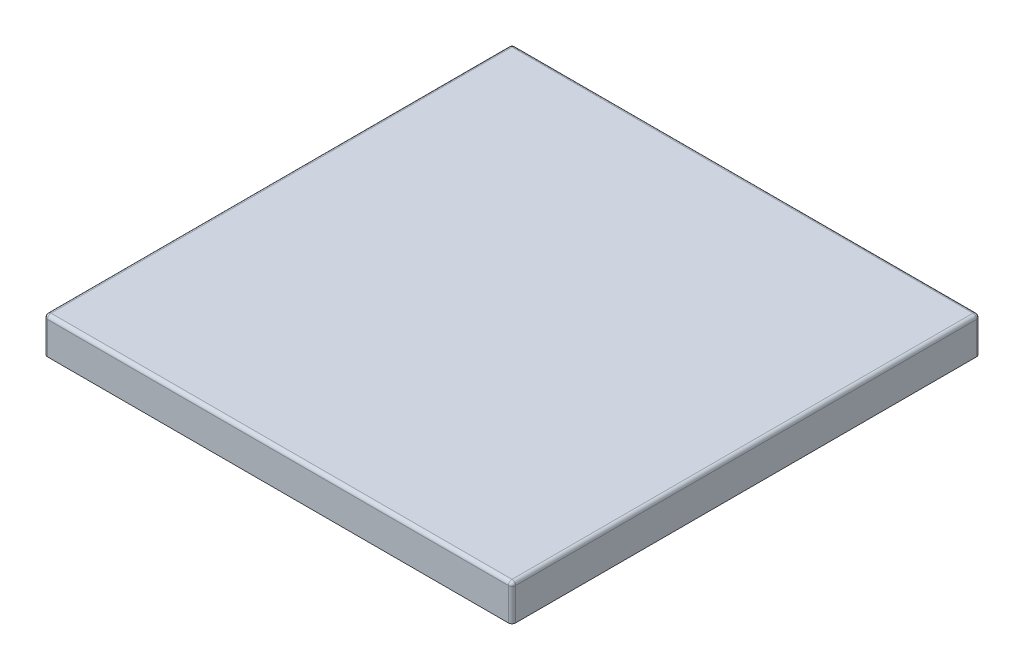
ISO-10303-21;
HEADER;
FILE_DESCRIPTION(('STEP AP214'),'2;1');
FILE_NAME('part.step','',(''),(''),'','','');
FILE_SCHEMA(('AUTOMOTIVE_DESIGN { 1 0 10303 214 1 1 1 1 }'));
ENDSEC;
DATA;
#1=APPLICATION_CONTEXT('core data for automotive mechanical design processes');
#2=APPLICATION_PROTOCOL_DEFINITION('international standard','automotive_design',2000,#1);
#3=PRODUCT_CONTEXT('',#1,'mechanical');
#4=PRODUCT('Part','Part','',(#3));
#5=PRODUCT_RELATED_PRODUCT_CATEGORY('part','',(#4));
#6=PRODUCT_DEFINITION_FORMATION('','',#4);
#7=PRODUCT_DEFINITION_CONTEXT('part definition',#1,'design');
#8=PRODUCT_DEFINITION('design','',#6,#7);
#9=PRODUCT_DEFINITION_SHAPE('','',#8);
#10=(LENGTH_UNIT() NAMED_UNIT(*) SI_UNIT(.MILLI.,.METRE.));
#11=(NAMED_UNIT(*) PLANE_ANGLE_UNIT() SI_UNIT($,.RADIAN.));
#12=(NAMED_UNIT(*) SI_UNIT($,.STERADIAN.) SOLID_ANGLE_UNIT());
#13=UNCERTAINTY_MEASURE_WITH_UNIT(LENGTH_MEASURE(1.E-05),#10,'distance_accuracy_value','');
#14=(GEOMETRIC_REPRESENTATION_CONTEXT(3) GLOBAL_UNCERTAINTY_ASSIGNED_CONTEXT((#13)) GLOBAL_UNIT_ASSIGNED_CONTEXT((#10,
#11,#12)) REPRESENTATION_CONTEXT('',''));
#15=CARTESIAN_POINT('',(0.,0.,0.));
#16=DIRECTION('',(0.,0.,1.));
#17=DIRECTION('',(1.,0.,0.));
#18=AXIS2_PLACEMENT_3D('',#15,#16,#17);
#19=CARTESIAN_POINT('',(65.,10.,65.));
#20=DIRECTION('',(-1.,0.,0.));
#21=DIRECTION('',(0.,0.,1.));
#22=AXIS2_PLACEMENT_3D('',#19,#20,#21);
#23=PLANE('',#22);
#24=DIRECTION('',(0.,-1.,0.));
#25=VECTOR('',#24,1.);
#26=CARTESIAN_POINT('',(65.,10.,-64.));
#27=LINE('',#26,#25);
#28=CARTESIAN_POINT('',(65.,0.,-64.));
#29=VERTEX_POINT('',#28);
#30=CARTESIAN_POINT('',(65.,9.,-64.));
#31=VERTEX_POINT('',#30);
#32=EDGE_CURVE('E164',#29,#31,#27,.F.);
#33=ORIENTED_EDGE('',*,*,#32,.T.);
#34=DIRECTION('',(0.,0.,-1.));
#35=VECTOR('',#34,1.);
#36=CARTESIAN_POINT('',(65.,9.,65.));
#37=LINE('',#36,#35);
#38=CARTESIAN_POINT('',(65.,9.,64.));
#39=VERTEX_POINT('',#38);
#40=EDGE_CURVE('E201',#31,#39,#37,.F.);
#41=ORIENTED_EDGE('',*,*,#40,.T.);
#42=DIRECTION('',(0.,-1.,0.));
#43=VECTOR('',#42,1.);
#44=CARTESIAN_POINT('',(65.,10.,64.));
#45=LINE('',#44,#43);
#46=CARTESIAN_POINT('',(65.,0.,64.));
#47=VERTEX_POINT('',#46);
#48=EDGE_CURVE('E168',#39,#47,#45,.T.);
#49=ORIENTED_EDGE('',*,*,#48,.T.);
#50=DIRECTION('',(0.,0.,-1.));
#51=VECTOR('',#50,1.);
#52=CARTESIAN_POINT('',(65.,0.,65.));
#53=LINE('',#52,#51);
#54=EDGE_CURVE('E241',#47,#29,#53,.T.);
#55=ORIENTED_EDGE('',*,*,#54,.T.);
#56=EDGE_LOOP('',(#33,#41,#49,#55));
#57=FACE_BOUND('',#56,.T.);
#58=ADVANCED_FACE('F41',(#57),#23,.F.);
#59=CARTESIAN_POINT('',(-65.,10.,-65.));
#60=DIRECTION('',(0.,0.,1.));
#61=DIRECTION('',(1.,0.,0.));
#62=AXIS2_PLACEMENT_3D('',#59,#60,#61);
#63=PLANE('',#62);
#64=DIRECTION('',(0.,-1.,0.));
#65=VECTOR('',#64,1.);
#66=CARTESIAN_POINT('',(-64.,10.,-65.));
#67=LINE('',#66,#65);
#68=CARTESIAN_POINT('',(-64.,0.,-65.));
#69=VERTEX_POINT('',#68);
#70=CARTESIAN_POINT('',(-64.,9.,-65.));
#71=VERTEX_POINT('',#70);
#72=EDGE_CURVE('E171',#69,#71,#67,.F.);
#73=ORIENTED_EDGE('',*,*,#72,.T.);
#74=DIRECTION('',(-1.,0.,0.));
#75=VECTOR('',#74,1.);
#76=CARTESIAN_POINT('',(-65.,9.,-65.));
#77=LINE('',#76,#75);
#78=CARTESIAN_POINT('',(64.,9.,-65.));
#79=VERTEX_POINT('',#78);
#80=EDGE_CURVE('E195',#71,#79,#77,.F.);
#81=ORIENTED_EDGE('',*,*,#80,.T.);
#82=DIRECTION('',(0.,-1.,0.));
#83=VECTOR('',#82,1.);
#84=CARTESIAN_POINT('',(64.,10.,-65.));
#85=LINE('',#84,#83);
#86=CARTESIAN_POINT('',(64.,0.,-65.));
#87=VERTEX_POINT('',#86);
#88=EDGE_CURVE('E175',#79,#87,#85,.T.);
#89=ORIENTED_EDGE('',*,*,#88,.T.);
#90=DIRECTION('',(-1.,0.,0.));
#91=VECTOR('',#90,1.);
#92=CARTESIAN_POINT('',(-65.,0.,-65.));
#93=LINE('',#92,#91);
#94=EDGE_CURVE('E149',#87,#69,#93,.T.);
#95=ORIENTED_EDGE('',*,*,#94,.T.);
#96=EDGE_LOOP('',(#73,#81,#89,#95));
#97=FACE_BOUND('',#96,.T.);
#98=ADVANCED_FACE('F255',(#97),#63,.F.);
#99=CARTESIAN_POINT('',(-65.,10.,65.));
#100=DIRECTION('',(1.,0.,0.));
#101=DIRECTION('',(0.,0.,-1.));
#102=AXIS2_PLACEMENT_3D('',#99,#100,#101);
#103=PLANE('',#102);
#104=DIRECTION('',(0.,-1.,0.));
#105=VECTOR('',#104,1.);
#106=CARTESIAN_POINT('',(-65.,10.,64.));
#107=LINE('',#106,#105);
#108=CARTESIAN_POINT('',(-65.,0.,64.));
#109=VERTEX_POINT('',#108);
#110=CARTESIAN_POINT('',(-65.,9.,64.));
#111=VERTEX_POINT('',#110);
#112=EDGE_CURVE('E132',#109,#111,#107,.F.);
#113=ORIENTED_EDGE('',*,*,#112,.T.);
#114=DIRECTION('',(0.,0.,1.));
#115=VECTOR('',#114,1.);
#116=CARTESIAN_POINT('',(-65.,9.,65.));
#117=LINE('',#116,#115);
#118=CARTESIAN_POINT('',(-65.,9.,-64.));
#119=VERTEX_POINT('',#118);
#120=EDGE_CURVE('E11',#111,#119,#117,.F.);
#121=ORIENTED_EDGE('',*,*,#120,.T.);
#122=DIRECTION('',(0.,-1.,0.));
#123=VECTOR('',#122,1.);
#124=CARTESIAN_POINT('',(-65.,10.,-64.));
#125=LINE('',#124,#123);
#126=CARTESIAN_POINT('',(-65.,0.,-64.));
#127=VERTEX_POINT('',#126);
#128=EDGE_CURVE('E137',#119,#127,#125,.T.);
#129=ORIENTED_EDGE('',*,*,#128,.T.);
#130=DIRECTION('',(0.,0.,1.));
#131=VECTOR('',#130,1.);
#132=CARTESIAN_POINT('',(-65.,0.,65.));
#133=LINE('',#132,#131);
#134=EDGE_CURVE('E144',#127,#109,#133,.T.);
#135=ORIENTED_EDGE('',*,*,#134,.T.);
#136=EDGE_LOOP('',(#113,#121,#129,#135));
#137=FACE_BOUND('',#136,.T.);
#138=ADVANCED_FACE('F307',(#137),#103,.F.);
#139=CARTESIAN_POINT('',(-65.,10.,65.));
#140=DIRECTION('',(0.,0.,-1.));
#141=DIRECTION('',(-1.,0.,0.));
#142=AXIS2_PLACEMENT_3D('',#139,#140,#141);
#143=PLANE('',#142);
#144=DIRECTION('',(0.,-1.,0.));
#145=VECTOR('',#144,1.);
#146=CARTESIAN_POINT('',(64.,10.,65.));
#147=LINE('',#146,#145);
#148=CARTESIAN_POINT('',(64.,0.,65.));
#149=VERTEX_POINT('',#148);
#150=CARTESIAN_POINT('',(64.,9.,65.));
#151=VERTEX_POINT('',#150);
#152=EDGE_CURVE('E128',#149,#151,#147,.F.);
#153=ORIENTED_EDGE('',*,*,#152,.T.);
#154=DIRECTION('',(1.,0.,0.));
#155=VECTOR('',#154,1.);
#156=CARTESIAN_POINT('',(-65.,9.,65.));
#157=LINE('',#156,#155);
#158=CARTESIAN_POINT('',(-64.,9.,65.));
#159=VERTEX_POINT('',#158);
#160=EDGE_CURVE('E66',#151,#159,#157,.F.);
#161=ORIENTED_EDGE('',*,*,#160,.T.);
#162=DIRECTION('',(0.,-1.,0.));
#163=VECTOR('',#162,1.);
#164=CARTESIAN_POINT('',(-64.,10.,65.));
#165=LINE('',#164,#163);
#166=CARTESIAN_POINT('',(-64.,0.,65.));
#167=VERTEX_POINT('',#166);
#168=EDGE_CURVE('E119',#159,#167,#165,.T.);
#169=ORIENTED_EDGE('',*,*,#168,.T.);
#170=DIRECTION('',(1.,0.,0.));
#171=VECTOR('',#170,1.);
#172=CARTESIAN_POINT('',(-65.,0.,65.));
#173=LINE('',#172,#171);
#174=EDGE_CURVE('E123',#167,#149,#173,.T.);
#175=ORIENTED_EDGE('',*,*,#174,.T.);
#176=EDGE_LOOP('',(#153,#161,#169,#175));
#177=FACE_BOUND('',#176,.T.);
#178=ADVANCED_FACE('F121',(#177),#143,.F.);
#179=CARTESIAN_POINT('',(0.,10.,0.));
#180=DIRECTION('',(0.,-1.,0.));
#181=DIRECTION('',(0.,0.,-1.));
#182=AXIS2_PLACEMENT_3D('',#179,#180,#181);
#183=PLANE('',#182);
#184=DIRECTION('',(0.,0.,-1.));
#185=VECTOR('',#184,1.);
#186=CARTESIAN_POINT('',(64.,10.,0.));
#187=LINE('',#186,#185);
#188=CARTESIAN_POINT('',(64.,10.,64.));
#189=VERTEX_POINT('',#188);
#190=CARTESIAN_POINT('',(64.,10.,-64.));
#191=VERTEX_POINT('',#190);
#192=EDGE_CURVE('E188',#189,#191,#187,.T.);
#193=ORIENTED_EDGE('',*,*,#192,.T.);
#194=DIRECTION('',(-1.,0.,0.));
#195=VECTOR('',#194,1.);
#196=CARTESIAN_POINT('',(0.,10.,-64.));
#197=LINE('',#196,#195);
#198=CARTESIAN_POINT('',(-64.,10.,-64.));
#199=VERTEX_POINT('',#198);
#200=EDGE_CURVE('E191',#191,#199,#197,.T.);
#201=ORIENTED_EDGE('',*,*,#200,.T.);
#202=DIRECTION('',(0.,0.,1.));
#203=VECTOR('',#202,1.);
#204=CARTESIAN_POINT('',(-64.,10.,0.));
#205=LINE('',#204,#203);
#206=CARTESIAN_POINT('',(-64.,10.,64.));
#207=VERTEX_POINT('',#206);
#208=EDGE_CURVE('E182',#199,#207,#205,.T.);
#209=ORIENTED_EDGE('',*,*,#208,.T.);
#210=DIRECTION('',(1.,0.,0.));
#211=VECTOR('',#210,1.);
#212=CARTESIAN_POINT('',(0.,10.,64.));
#213=LINE('',#212,#211);
#214=EDGE_CURVE('E185',#207,#189,#213,.T.);
#215=ORIENTED_EDGE('',*,*,#214,.T.);
#216=EDGE_LOOP('',(#193,#201,#209,#215));
#217=FACE_BOUND('',#216,.T.);
#218=ADVANCED_FACE('F275',(#217),#183,.F.);
#219=CARTESIAN_POINT('',(0.,0.,0.));
#220=DIRECTION('',(0.,-1.,0.));
#221=DIRECTION('',(0.,0.,-1.));
#222=AXIS2_PLACEMENT_3D('',#219,#220,#221);
#223=PLANE('',#222);
#224=ORIENTED_EDGE('',*,*,#174,.F.);
#225=CARTESIAN_POINT('',(-64.,0.,64.));
#226=DIRECTION('',(0.,-1.,0.));
#227=DIRECTION('',(0.,0.,-1.));
#228=AXIS2_PLACEMENT_3D('',#225,#226,#227);
#229=CIRCLE('',#228,1.);
#230=EDGE_CURVE('E130',#167,#109,#229,.T.);
#231=ORIENTED_EDGE('',*,*,#230,.T.);
#232=ORIENTED_EDGE('',*,*,#134,.F.);
#233=CARTESIAN_POINT('',(-64.,0.,-64.));
#234=DIRECTION('',(0.,-1.,0.));
#235=DIRECTION('',(0.,0.,-1.));
#236=AXIS2_PLACEMENT_3D('',#233,#234,#235);
#237=CIRCLE('',#236,1.);
#238=EDGE_CURVE('E127',#127,#69,#237,.T.);
#239=ORIENTED_EDGE('',*,*,#238,.T.);
#240=ORIENTED_EDGE('',*,*,#94,.F.);
#241=CARTESIAN_POINT('',(64.,0.,-64.));
#242=DIRECTION('',(0.,-1.,0.));
#243=DIRECTION('',(0.,0.,-1.));
#244=AXIS2_PLACEMENT_3D('',#241,#242,#243);
#245=CIRCLE('',#244,1.);
#246=EDGE_CURVE('E155',#87,#29,#245,.T.);
#247=ORIENTED_EDGE('',*,*,#246,.T.);
#248=ORIENTED_EDGE('',*,*,#54,.F.);
#249=CARTESIAN_POINT('',(64.,0.,64.));
#250=DIRECTION('',(0.,-1.,0.));
#251=DIRECTION('',(0.,0.,-1.));
#252=AXIS2_PLACEMENT_3D('',#249,#250,#251);
#253=CIRCLE('',#252,1.);
#254=EDGE_CURVE('E138',#47,#149,#253,.T.);
#255=ORIENTED_EDGE('',*,*,#254,.T.);
#256=EDGE_LOOP('',(#224,#231,#232,#239,#240,#247,#248,#255));
#257=FACE_BOUND('',#256,.T.);
#258=ADVANCED_FACE('F140',(#257),#223,.T.);
#259=CARTESIAN_POINT('',(-64.,10.,64.));
#260=DIRECTION('',(0.,-1.,0.));
#261=DIRECTION('',(0.,0.,-1.));
#262=AXIS2_PLACEMENT_3D('',#259,#260,#261);
#263=CYLINDRICAL_SURFACE('',#262,1.);
#264=ORIENTED_EDGE('',*,*,#168,.F.);
#265=CARTESIAN_POINT('',(-64.,9.,64.));
#266=DIRECTION('',(0.,-1.,0.));
#267=DIRECTION('',(0.,0.,-1.));
#268=AXIS2_PLACEMENT_3D('',#265,#266,#267);
#269=CIRCLE('',#268,1.);
#270=EDGE_CURVE('E51',#159,#111,#269,.T.);
#271=ORIENTED_EDGE('',*,*,#270,.T.);
#272=ORIENTED_EDGE('',*,*,#112,.F.);
#273=ORIENTED_EDGE('',*,*,#230,.F.);
#274=EDGE_LOOP('',(#264,#271,#272,#273));
#275=FACE_BOUND('',#274,.T.);
#276=ADVANCED_FACE('F131',(#275),#263,.T.);
#277=CARTESIAN_POINT('',(64.,10.,64.));
#278=DIRECTION('',(0.,-1.,0.));
#279=DIRECTION('',(0.,0.,-1.));
#280=AXIS2_PLACEMENT_3D('',#277,#278,#279);
#281=CYLINDRICAL_SURFACE('',#280,1.);
#282=ORIENTED_EDGE('',*,*,#48,.F.);
#283=CARTESIAN_POINT('',(64.,9.,64.));
#284=DIRECTION('',(0.,-1.,0.));
#285=DIRECTION('',(0.,0.,-1.));
#286=AXIS2_PLACEMENT_3D('',#283,#284,#285);
#287=CIRCLE('',#286,1.);
#288=EDGE_CURVE('E204',#39,#151,#287,.T.);
#289=ORIENTED_EDGE('',*,*,#288,.T.);
#290=ORIENTED_EDGE('',*,*,#152,.F.);
#291=ORIENTED_EDGE('',*,*,#254,.F.);
#292=EDGE_LOOP('',(#282,#289,#290,#291));
#293=FACE_BOUND('',#292,.T.);
#294=ADVANCED_FACE('F289',(#293),#281,.T.);
#295=CARTESIAN_POINT('',(64.,10.,-64.));
#296=DIRECTION('',(0.,-1.,0.));
#297=DIRECTION('',(0.,0.,-1.));
#298=AXIS2_PLACEMENT_3D('',#295,#296,#297);
#299=CYLINDRICAL_SURFACE('',#298,1.);
#300=ORIENTED_EDGE('',*,*,#88,.F.);
#301=CARTESIAN_POINT('',(64.,9.,-64.));
#302=DIRECTION('',(0.,-1.,0.));
#303=DIRECTION('',(0.,0.,-1.));
#304=AXIS2_PLACEMENT_3D('',#301,#302,#303);
#305=CIRCLE('',#304,1.);
#306=EDGE_CURVE('E198',#79,#31,#305,.T.);
#307=ORIENTED_EDGE('',*,*,#306,.T.);
#308=ORIENTED_EDGE('',*,*,#32,.F.);
#309=ORIENTED_EDGE('',*,*,#246,.F.);
#310=EDGE_LOOP('',(#300,#307,#308,#309));
#311=FACE_BOUND('',#310,.T.);
#312=ADVANCED_FACE('F282',(#311),#299,.T.);
#313=CARTESIAN_POINT('',(-64.,10.,-64.));
#314=DIRECTION('',(0.,-1.,0.));
#315=DIRECTION('',(0.,0.,-1.));
#316=AXIS2_PLACEMENT_3D('',#313,#314,#315);
#317=CYLINDRICAL_SURFACE('',#316,1.);
#318=ORIENTED_EDGE('',*,*,#128,.F.);
#319=CARTESIAN_POINT('',(-64.,9.,-64.));
#320=DIRECTION('',(0.,-1.,0.));
#321=DIRECTION('',(0.,0.,-1.));
#322=AXIS2_PLACEMENT_3D('',#319,#320,#321);
#323=CIRCLE('',#322,1.);
#324=EDGE_CURVE('E178',#119,#71,#323,.T.);
#325=ORIENTED_EDGE('',*,*,#324,.T.);
#326=ORIENTED_EDGE('',*,*,#72,.F.);
#327=ORIENTED_EDGE('',*,*,#238,.F.);
#328=EDGE_LOOP('',(#318,#325,#326,#327));
#329=FACE_BOUND('',#328,.T.);
#330=ADVANCED_FACE('F261',(#329),#317,.T.);
#331=CARTESIAN_POINT('',(64.,9.,64.));
#332=DIRECTION('',(0.,-1.,0.));
#333=DIRECTION('',(0.,0.,-1.));
#334=AXIS2_PLACEMENT_3D('',#331,#332,#333);
#335=SPHERICAL_SURFACE('',#334,1.);
#336=CARTESIAN_POINT('',(64.,9.,64.));
#337=DIRECTION('',(-1.,0.,0.));
#338=DIRECTION('',(0.,0.,1.));
#339=AXIS2_PLACEMENT_3D('',#336,#337,#338);
#340=CIRCLE('',#339,1.);
#341=EDGE_CURVE('E232',#151,#189,#340,.T.);
#342=ORIENTED_EDGE('',*,*,#341,.F.);
#343=ORIENTED_EDGE('',*,*,#288,.F.);
#344=CARTESIAN_POINT('',(64.,9.,64.));
#345=DIRECTION('',(0.,0.,-1.));
#346=DIRECTION('',(-1.,0.,0.));
#347=AXIS2_PLACEMENT_3D('',#344,#345,#346);
#348=CIRCLE('',#347,1.);
#349=EDGE_CURVE('E45',#189,#39,#348,.T.);
#350=ORIENTED_EDGE('',*,*,#349,.F.);
#351=EDGE_LOOP('',(#342,#343,#350));
#352=FACE_BOUND('',#351,.T.);
#353=ADVANCED_FACE('F43',(#352),#335,.T.);
#354=CARTESIAN_POINT('',(64.,9.,0.));
#355=DIRECTION('',(0.,0.,-1.));
#356=DIRECTION('',(-1.,0.,0.));
#357=AXIS2_PLACEMENT_3D('',#354,#355,#356);
#358=CYLINDRICAL_SURFACE('',#357,1.);
#359=ORIENTED_EDGE('',*,*,#349,.T.);
#360=ORIENTED_EDGE('',*,*,#40,.F.);
#361=CARTESIAN_POINT('',(64.,9.,-64.));
#362=DIRECTION('',(0.,0.,-1.));
#363=DIRECTION('',(-1.,0.,0.));
#364=AXIS2_PLACEMENT_3D('',#361,#362,#363);
#365=CIRCLE('',#364,1.);
#366=EDGE_CURVE('E229',#191,#31,#365,.T.);
#367=ORIENTED_EDGE('',*,*,#366,.F.);
#368=ORIENTED_EDGE('',*,*,#192,.F.);
#369=EDGE_LOOP('',(#359,#360,#367,#368));
#370=FACE_BOUND('',#369,.T.);
#371=ADVANCED_FACE('F285',(#370),#358,.T.);
#372=CARTESIAN_POINT('',(0.,9.,64.));
#373=DIRECTION('',(1.,0.,0.));
#374=DIRECTION('',(0.,0.,-1.));
#375=AXIS2_PLACEMENT_3D('',#372,#373,#374);
#376=CYLINDRICAL_SURFACE('',#375,1.);
#377=ORIENTED_EDGE('',*,*,#341,.T.);
#378=ORIENTED_EDGE('',*,*,#214,.F.);
#379=CARTESIAN_POINT('',(-64.,9.,64.));
#380=DIRECTION('',(-1.,0.,0.));
#381=DIRECTION('',(0.,0.,1.));
#382=AXIS2_PLACEMENT_3D('',#379,#380,#381);
#383=CIRCLE('',#382,1.);
#384=EDGE_CURVE('E225',#159,#207,#383,.T.);
#385=ORIENTED_EDGE('',*,*,#384,.F.);
#386=ORIENTED_EDGE('',*,*,#160,.F.);
#387=EDGE_LOOP('',(#377,#378,#385,#386));
#388=FACE_BOUND('',#387,.T.);
#389=ADVANCED_FACE('F291',(#388),#376,.T.);
#390=CARTESIAN_POINT('',(64.,9.,-64.));
#391=DIRECTION('',(0.,-1.,0.));
#392=DIRECTION('',(0.,0.,-1.));
#393=AXIS2_PLACEMENT_3D('',#390,#391,#392);
#394=SPHERICAL_SURFACE('',#393,1.);
#395=ORIENTED_EDGE('',*,*,#366,.T.);
#396=ORIENTED_EDGE('',*,*,#306,.F.);
#397=CARTESIAN_POINT('',(64.,9.,-64.));
#398=DIRECTION('',(-1.,0.,0.));
#399=DIRECTION('',(0.,0.,1.));
#400=AXIS2_PLACEMENT_3D('',#397,#398,#399);
#401=CIRCLE('',#400,1.);
#402=EDGE_CURVE('E221',#191,#79,#401,.T.);
#403=ORIENTED_EDGE('',*,*,#402,.F.);
#404=EDGE_LOOP('',(#395,#396,#403));
#405=FACE_BOUND('',#404,.T.);
#406=ADVANCED_FACE('F284',(#405),#394,.T.);
#407=CARTESIAN_POINT('',(-64.,9.,64.));
#408=DIRECTION('',(0.,-1.,0.));
#409=DIRECTION('',(0.,0.,-1.));
#410=AXIS2_PLACEMENT_3D('',#407,#408,#409);
#411=SPHERICAL_SURFACE('',#410,1.);
#412=ORIENTED_EDGE('',*,*,#270,.F.);
#413=ORIENTED_EDGE('',*,*,#384,.T.);
#414=CARTESIAN_POINT('',(-64.,9.,64.));
#415=DIRECTION('',(0.,0.,-1.));
#416=DIRECTION('',(-1.,0.,0.));
#417=AXIS2_PLACEMENT_3D('',#414,#415,#416);
#418=CIRCLE('',#417,1.);
#419=EDGE_CURVE('E217',#111,#207,#418,.T.);
#420=ORIENTED_EDGE('',*,*,#419,.F.);
#421=EDGE_LOOP('',(#412,#413,#420));
#422=FACE_BOUND('',#421,.T.);
#423=ADVANCED_FACE('F293',(#422),#411,.T.);
#424=CARTESIAN_POINT('',(0.,9.,-64.));
#425=DIRECTION('',(-1.,0.,0.));
#426=DIRECTION('',(0.,0.,1.));
#427=AXIS2_PLACEMENT_3D('',#424,#425,#426);
#428=CYLINDRICAL_SURFACE('',#427,1.);
#429=ORIENTED_EDGE('',*,*,#402,.T.);
#430=ORIENTED_EDGE('',*,*,#80,.F.);
#431=CARTESIAN_POINT('',(-64.,9.,-64.));
#432=DIRECTION('',(-1.,0.,0.));
#433=DIRECTION('',(0.,0.,1.));
#434=AXIS2_PLACEMENT_3D('',#431,#432,#433);
#435=CIRCLE('',#434,1.);
#436=EDGE_CURVE('E214',#199,#71,#435,.T.);
#437=ORIENTED_EDGE('',*,*,#436,.F.);
#438=ORIENTED_EDGE('',*,*,#200,.F.);
#439=EDGE_LOOP('',(#429,#430,#437,#438));
#440=FACE_BOUND('',#439,.T.);
#441=ADVANCED_FACE('F278',(#440),#428,.T.);
#442=CARTESIAN_POINT('',(-64.,9.,0.));
#443=DIRECTION('',(0.,0.,1.));
#444=DIRECTION('',(1.,0.,0.));
#445=AXIS2_PLACEMENT_3D('',#442,#443,#444);
#446=CYLINDRICAL_SURFACE('',#445,1.);
#447=ORIENTED_EDGE('',*,*,#419,.T.);
#448=ORIENTED_EDGE('',*,*,#208,.F.);
#449=CARTESIAN_POINT('',(-64.,9.,-64.));
#450=DIRECTION('',(0.,0.,-1.));
#451=DIRECTION('',(-1.,0.,0.));
#452=AXIS2_PLACEMENT_3D('',#449,#450,#451);
#453=CIRCLE('',#452,1.);
#454=EDGE_CURVE('E211',#119,#199,#453,.T.);
#455=ORIENTED_EDGE('',*,*,#454,.F.);
#456=ORIENTED_EDGE('',*,*,#120,.F.);
#457=EDGE_LOOP('',(#447,#448,#455,#456));
#458=FACE_BOUND('',#457,.T.);
#459=ADVANCED_FACE('F271',(#458),#446,.T.);
#460=CARTESIAN_POINT('',(-64.,9.,-64.));
#461=DIRECTION('',(0.,-1.,0.));
#462=DIRECTION('',(0.,0.,-1.));
#463=AXIS2_PLACEMENT_3D('',#460,#461,#462);
#464=SPHERICAL_SURFACE('',#463,1.);
#465=ORIENTED_EDGE('',*,*,#436,.T.);
#466=ORIENTED_EDGE('',*,*,#324,.F.);
#467=ORIENTED_EDGE('',*,*,#454,.T.);
#468=EDGE_LOOP('',(#465,#466,#467));
#469=FACE_BOUND('',#468,.T.);
#470=ADVANCED_FACE('F265',(#469),#464,.T.);
#471=CLOSED_SHELL('',(#58,#98,#138,#178,#218,#258,#276,#294,#312,#330,#353,#371,#389,#406,#423,
#441,#459,#470));
#472=MANIFOLD_SOLID_BREP('B2',#471);
#473=ADVANCED_BREP_SHAPE_REPRESENTATION('',(#18,#472),#14);
#474=SHAPE_DEFINITION_REPRESENTATION(#9,#473);
ENDSEC;
END-ISO-10303-21;
